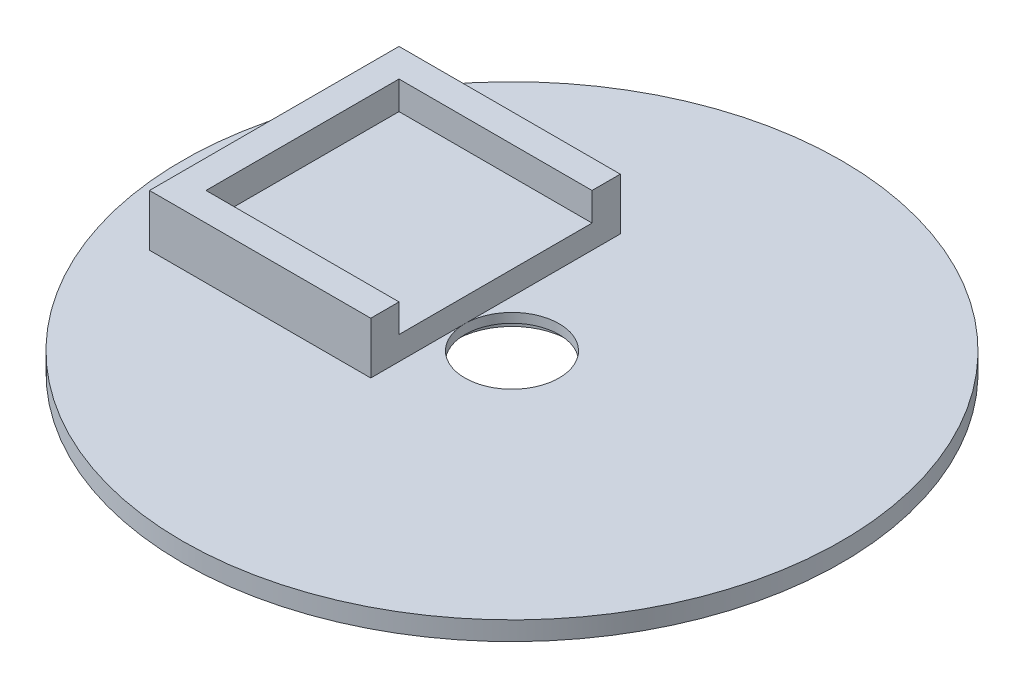
ISO-10303-21;
HEADER;
FILE_DESCRIPTION(('STEP AP214'),'2;1');
FILE_NAME('part.step','',(''),(''),'','','');
FILE_SCHEMA(('AUTOMOTIVE_DESIGN { 1 0 10303 214 1 1 1 1 }'));
ENDSEC;
DATA;
#1=APPLICATION_CONTEXT('core data for automotive mechanical design processes');
#2=APPLICATION_PROTOCOL_DEFINITION('international standard','automotive_design',2000,#1);
#3=PRODUCT_CONTEXT('',#1,'mechanical');
#4=PRODUCT('Part','Part','',(#3));
#5=PRODUCT_RELATED_PRODUCT_CATEGORY('part','',(#4));
#6=PRODUCT_DEFINITION_FORMATION('','',#4);
#7=PRODUCT_DEFINITION_CONTEXT('part definition',#1,'design');
#8=PRODUCT_DEFINITION('design','',#6,#7);
#9=PRODUCT_DEFINITION_SHAPE('','',#8);
#10=(LENGTH_UNIT() NAMED_UNIT(*) SI_UNIT(.MILLI.,.METRE.));
#11=(NAMED_UNIT(*) PLANE_ANGLE_UNIT() SI_UNIT($,.RADIAN.));
#12=(NAMED_UNIT(*) SI_UNIT($,.STERADIAN.) SOLID_ANGLE_UNIT());
#13=UNCERTAINTY_MEASURE_WITH_UNIT(LENGTH_MEASURE(1.E-05),#10,'distance_accuracy_value','');
#14=(GEOMETRIC_REPRESENTATION_CONTEXT(3) GLOBAL_UNCERTAINTY_ASSIGNED_CONTEXT((#13)) GLOBAL_UNIT_ASSIGNED_CONTEXT((#10,
#11,#12)) REPRESENTATION_CONTEXT('',''));
#15=CARTESIAN_POINT('',(0.,0.,0.));
#16=DIRECTION('',(0.,0.,1.));
#17=DIRECTION('',(1.,0.,0.));
#18=AXIS2_PLACEMENT_3D('',#15,#16,#17);
#19=CARTESIAN_POINT('',(0.,2.,0.));
#20=DIRECTION('',(0.,1.,0.));
#21=DIRECTION('',(0.,0.,1.));
#22=AXIS2_PLACEMENT_3D('',#19,#20,#21);
#23=PLANE('',#22);
#24=CARTESIAN_POINT('',(0.,2.,0.));
#25=DIRECTION('',(0.,1.,0.));
#26=DIRECTION('',(0.,0.,1.));
#27=AXIS2_PLACEMENT_3D('',#24,#25,#26);
#28=CIRCLE('',#27,35.);
#29=CARTESIAN_POINT('',(0.,2.,35.));
#30=VERTEX_POINT('',#29);
#31=EDGE_CURVE('E42',#30,#30,#28,.T.);
#32=ORIENTED_EDGE('',*,*,#31,.T.);
#33=EDGE_LOOP('',(#32));
#34=FACE_BOUND('',#33,.T.);
#35=DIRECTION('',(0.,0.,1.));
#36=VECTOR('',#35,1.);
#37=CARTESIAN_POINT('',(-5.,2.,0.));
#38=LINE('',#37,#36);
#39=CARTESIAN_POINT('',(-5.,2.,-16.5));
#40=VERTEX_POINT('',#39);
#41=CARTESIAN_POINT('',(-5.,2.,0.));
#42=VERTEX_POINT('',#41);
#43=EDGE_CURVE('E170',#40,#42,#38,.T.);
#44=ORIENTED_EDGE('',*,*,#43,.T.);
#45=CARTESIAN_POINT('',(0.,2.,0.));
#46=DIRECTION('',(0.,1.,0.));
#47=DIRECTION('',(0.,0.,1.));
#48=AXIS2_PLACEMENT_3D('',#45,#46,#47);
#49=CIRCLE('',#48,5.);
#50=EDGE_CURVE('E128',#42,#42,#49,.T.);
#51=ORIENTED_EDGE('',*,*,#50,.F.);
#52=DIRECTION('',(0.,0.,1.));
#53=VECTOR('',#52,1.);
#54=CARTESIAN_POINT('',(-5.,2.,0.));
#55=LINE('',#54,#53);
#56=CARTESIAN_POINT('',(-5.,2.,10.));
#57=VERTEX_POINT('',#56);
#58=EDGE_CURVE('E158',#42,#57,#55,.T.);
#59=ORIENTED_EDGE('',*,*,#58,.T.);
#60=DIRECTION('',(-1.,0.,0.));
#61=VECTOR('',#60,1.);
#62=CARTESIAN_POINT('',(0.,2.,10.));
#63=LINE('',#62,#61);
#64=CARTESIAN_POINT('',(-28.5,2.,10.));
#65=VERTEX_POINT('',#64);
#66=EDGE_CURVE('E161',#57,#65,#63,.T.);
#67=ORIENTED_EDGE('',*,*,#66,.T.);
#68=DIRECTION('',(0.,0.,-1.));
#69=VECTOR('',#68,1.);
#70=CARTESIAN_POINT('',(-28.5,2.,0.));
#71=LINE('',#70,#69);
#72=CARTESIAN_POINT('',(-28.5,2.,-16.5));
#73=VERTEX_POINT('',#72);
#74=EDGE_CURVE('E164',#65,#73,#71,.T.);
#75=ORIENTED_EDGE('',*,*,#74,.T.);
#76=DIRECTION('',(1.,0.,0.));
#77=VECTOR('',#76,1.);
#78=CARTESIAN_POINT('',(0.,2.,-16.5));
#79=LINE('',#78,#77);
#80=EDGE_CURVE('E167',#73,#40,#79,.T.);
#81=ORIENTED_EDGE('',*,*,#80,.T.);
#82=EDGE_LOOP('',(#44,#51,#59,#67,#75,#81));
#83=FACE_BOUND('',#82,.T.);
#84=ADVANCED_FACE('F34',(#34,#83),#23,.T.);
#85=CARTESIAN_POINT('',(-25.5,7.5,-13.5));
#86=DIRECTION('',(-1.,0.,0.));
#87=DIRECTION('',(0.,0.,1.));
#88=AXIS2_PLACEMENT_3D('',#85,#86,#87);
#89=PLANE('',#88);
#90=DIRECTION('',(0.,0.,1.));
#91=VECTOR('',#90,1.);
#92=CARTESIAN_POINT('',(-25.5,4.5,-13.5));
#93=LINE('',#92,#91);
#94=CARTESIAN_POINT('',(-25.5,4.5,-13.5));
#95=VERTEX_POINT('',#94);
#96=CARTESIAN_POINT('',(-25.5,4.5,7.));
#97=VERTEX_POINT('',#96);
#98=EDGE_CURVE('E49',#95,#97,#93,.T.);
#99=ORIENTED_EDGE('',*,*,#98,.F.);
#100=DIRECTION('',(0.,-1.,0.));
#101=VECTOR('',#100,1.);
#102=CARTESIAN_POINT('',(-25.5,7.5,-13.5));
#103=LINE('',#102,#101);
#104=CARTESIAN_POINT('',(-25.5,7.5,-13.5));
#105=VERTEX_POINT('',#104);
#106=EDGE_CURVE('E156',#105,#95,#103,.T.);
#107=ORIENTED_EDGE('',*,*,#106,.F.);
#108=DIRECTION('',(0.,0.,-1.));
#109=VECTOR('',#108,1.);
#110=CARTESIAN_POINT('',(-25.5,7.5,-13.5));
#111=LINE('',#110,#109);
#112=CARTESIAN_POINT('',(-25.5,7.5,7.));
#113=VERTEX_POINT('',#112);
#114=EDGE_CURVE('E131',#113,#105,#111,.T.);
#115=ORIENTED_EDGE('',*,*,#114,.F.);
#116=DIRECTION('',(0.,-1.,0.));
#117=VECTOR('',#116,1.);
#118=CARTESIAN_POINT('',(-25.5,7.5,7.));
#119=LINE('',#118,#117);
#120=EDGE_CURVE('E113',#113,#97,#119,.T.);
#121=ORIENTED_EDGE('',*,*,#120,.T.);
#122=EDGE_LOOP('',(#99,#107,#115,#121));
#123=FACE_BOUND('',#122,.T.);
#124=ADVANCED_FACE('F202',(#123),#89,.F.);
#125=CARTESIAN_POINT('',(-5.,7.5,-13.5));
#126=DIRECTION('',(0.,0.,-1.));
#127=DIRECTION('',(-1.,0.,0.));
#128=AXIS2_PLACEMENT_3D('',#125,#126,#127);
#129=PLANE('',#128);
#130=DIRECTION('',(-1.,0.,0.));
#131=VECTOR('',#130,1.);
#132=CARTESIAN_POINT('',(-5.,4.5,-13.5));
#133=LINE('',#132,#131);
#134=CARTESIAN_POINT('',(-5.,4.5,-13.5));
#135=VERTEX_POINT('',#134);
#136=EDGE_CURVE('E56',#135,#95,#133,.T.);
#137=ORIENTED_EDGE('',*,*,#136,.F.);
#138=DIRECTION('',(0.,-1.,0.));
#139=VECTOR('',#138,1.);
#140=CARTESIAN_POINT('',(-5.,7.5,-13.5));
#141=LINE('',#140,#139);
#142=CARTESIAN_POINT('',(-5.,7.5,-13.5));
#143=VERTEX_POINT('',#142);
#144=EDGE_CURVE('E122',#143,#135,#141,.T.);
#145=ORIENTED_EDGE('',*,*,#144,.F.);
#146=DIRECTION('',(1.,0.,0.));
#147=VECTOR('',#146,1.);
#148=CARTESIAN_POINT('',(-5.,7.5,-13.5));
#149=LINE('',#148,#147);
#150=EDGE_CURVE('E134',#105,#143,#149,.T.);
#151=ORIENTED_EDGE('',*,*,#150,.F.);
#152=ORIENTED_EDGE('',*,*,#106,.T.);
#153=EDGE_LOOP('',(#137,#145,#151,#152));
#154=FACE_BOUND('',#153,.T.);
#155=ADVANCED_FACE('F208',(#154),#129,.F.);
#156=CARTESIAN_POINT('',(-5.,7.5,7.));
#157=DIRECTION('',(0.,0.,1.));
#158=DIRECTION('',(1.,0.,0.));
#159=AXIS2_PLACEMENT_3D('',#156,#157,#158);
#160=PLANE('',#159);
#161=DIRECTION('',(1.,0.,0.));
#162=VECTOR('',#161,1.);
#163=CARTESIAN_POINT('',(-5.,4.5,7.));
#164=LINE('',#163,#162);
#165=CARTESIAN_POINT('',(-5.,4.5,7.));
#166=VERTEX_POINT('',#165);
#167=EDGE_CURVE('E11',#97,#166,#164,.T.);
#168=ORIENTED_EDGE('',*,*,#167,.F.);
#169=ORIENTED_EDGE('',*,*,#120,.F.);
#170=DIRECTION('',(-1.,0.,0.));
#171=VECTOR('',#170,1.);
#172=CARTESIAN_POINT('',(-5.,7.5,7.));
#173=LINE('',#172,#171);
#174=CARTESIAN_POINT('',(-5.,7.5,7.));
#175=VERTEX_POINT('',#174);
#176=EDGE_CURVE('E108',#175,#113,#173,.T.);
#177=ORIENTED_EDGE('',*,*,#176,.F.);
#178=DIRECTION('',(0.,-1.,0.));
#179=VECTOR('',#178,1.);
#180=CARTESIAN_POINT('',(-5.,7.5,7.));
#181=LINE('',#180,#179);
#182=EDGE_CURVE('E105',#175,#166,#181,.T.);
#183=ORIENTED_EDGE('',*,*,#182,.T.);
#184=EDGE_LOOP('',(#168,#169,#177,#183));
#185=FACE_BOUND('',#184,.T.);
#186=ADVANCED_FACE('F106',(#185),#160,.F.);
#187=CARTESIAN_POINT('',(0.,2.,0.));
#188=DIRECTION('',(0.,-1.,0.));
#189=DIRECTION('',(0.,0.,-1.));
#190=AXIS2_PLACEMENT_3D('',#187,#188,#189);
#191=CYLINDRICAL_SURFACE('',#190,35.);
#192=ORIENTED_EDGE('',*,*,#31,.F.);
#193=EDGE_LOOP('',(#192));
#194=FACE_BOUND('',#193,.T.);
#195=CARTESIAN_POINT('',(0.,0.,0.));
#196=DIRECTION('',(0.,1.,0.));
#197=DIRECTION('',(0.,0.,1.));
#198=AXIS2_PLACEMENT_3D('',#195,#196,#197);
#199=CIRCLE('',#198,35.);
#200=CARTESIAN_POINT('',(0.,0.,35.));
#201=VERTEX_POINT('',#200);
#202=EDGE_CURVE('E176',#201,#201,#199,.T.);
#203=ORIENTED_EDGE('',*,*,#202,.T.);
#204=EDGE_LOOP('',(#203));
#205=FACE_BOUND('',#204,.T.);
#206=ADVANCED_FACE('F36',(#194,#205),#191,.T.);
#207=CARTESIAN_POINT('',(0.,0.,0.));
#208=DIRECTION('',(0.,1.,0.));
#209=DIRECTION('',(0.,0.,1.));
#210=AXIS2_PLACEMENT_3D('',#207,#208,#209);
#211=PLANE('',#210);
#212=ORIENTED_EDGE('',*,*,#202,.F.);
#213=EDGE_LOOP('',(#212));
#214=FACE_BOUND('',#213,.T.);
#215=CARTESIAN_POINT('',(0.,0.,0.));
#216=DIRECTION('',(0.,1.,0.));
#217=DIRECTION('',(0.,0.,1.));
#218=AXIS2_PLACEMENT_3D('',#215,#216,#217);
#219=CIRCLE('',#218,6.);
#220=CARTESIAN_POINT('',(0.,0.,6.));
#221=VERTEX_POINT('',#220);
#222=EDGE_CURVE('E172',#221,#221,#219,.T.);
#223=ORIENTED_EDGE('',*,*,#222,.T.);
#224=EDGE_LOOP('',(#223));
#225=FACE_BOUND('',#224,.T.);
#226=ADVANCED_FACE('F214',(#214,#225),#211,.F.);
#227=CARTESIAN_POINT('',(0.,1.,0.));
#228=DIRECTION('',(0.,-1.,0.));
#229=DIRECTION('',(0.,0.,-1.));
#230=AXIS2_PLACEMENT_3D('',#227,#228,#229);
#231=CYLINDRICAL_SURFACE('',#230,6.);
#232=CARTESIAN_POINT('',(0.,1.,0.));
#233=DIRECTION('',(0.,1.,0.));
#234=DIRECTION('',(0.,0.,1.));
#235=AXIS2_PLACEMENT_3D('',#232,#233,#234);
#236=CIRCLE('',#235,6.);
#237=CARTESIAN_POINT('',(0.,1.,6.));
#238=VERTEX_POINT('',#237);
#239=EDGE_CURVE('E173',#238,#238,#236,.T.);
#240=ORIENTED_EDGE('',*,*,#239,.T.);
#241=EDGE_LOOP('',(#240));
#242=FACE_BOUND('',#241,.T.);
#243=ORIENTED_EDGE('',*,*,#222,.F.);
#244=EDGE_LOOP('',(#243));
#245=FACE_BOUND('',#244,.T.);
#246=ADVANCED_FACE('F212',(#242,#245),#231,.F.);
#247=CARTESIAN_POINT('',(0.,1.,0.));
#248=DIRECTION('',(0.,1.,0.));
#249=DIRECTION('',(0.,0.,1.));
#250=AXIS2_PLACEMENT_3D('',#247,#248,#249);
#251=PLANE('',#250);
#252=CARTESIAN_POINT('',(0.,1.,0.));
#253=DIRECTION('',(0.,1.,0.));
#254=DIRECTION('',(0.,0.,1.));
#255=AXIS2_PLACEMENT_3D('',#252,#253,#254);
#256=CIRCLE('',#255,5.);
#257=CARTESIAN_POINT('',(0.,1.,5.));
#258=VERTEX_POINT('',#257);
#259=EDGE_CURVE('E127',#258,#258,#256,.T.);
#260=ORIENTED_EDGE('',*,*,#259,.T.);
#261=EDGE_LOOP('',(#260));
#262=FACE_BOUND('',#261,.T.);
#263=ORIENTED_EDGE('',*,*,#239,.F.);
#264=EDGE_LOOP('',(#263));
#265=FACE_BOUND('',#264,.T.);
#266=ADVANCED_FACE('F185',(#262,#265),#251,.F.);
#267=CARTESIAN_POINT('',(-5.,7.5,-13.5));
#268=DIRECTION('',(-1.,0.,0.));
#269=DIRECTION('',(0.,0.,1.));
#270=AXIS2_PLACEMENT_3D('',#267,#268,#269);
#271=PLANE('',#270);
#272=ORIENTED_EDGE('',*,*,#43,.F.);
#273=DIRECTION('',(0.,-1.,0.));
#274=VECTOR('',#273,1.);
#275=CARTESIAN_POINT('',(-5.,7.5,-16.5));
#276=LINE('',#275,#274);
#277=CARTESIAN_POINT('',(-5.,7.5,-16.5));
#278=VERTEX_POINT('',#277);
#279=EDGE_CURVE('E153',#278,#40,#276,.T.);
#280=ORIENTED_EDGE('',*,*,#279,.F.);
#281=DIRECTION('',(0.,0.,-1.));
#282=VECTOR('',#281,1.);
#283=CARTESIAN_POINT('',(-5.,7.5,-13.5));
#284=LINE('',#283,#282);
#285=EDGE_CURVE('E136',#143,#278,#284,.T.);
#286=ORIENTED_EDGE('',*,*,#285,.F.);
#287=ORIENTED_EDGE('',*,*,#144,.T.);
#288=DIRECTION('',(0.,0.,-1.));
#289=VECTOR('',#288,1.);
#290=CARTESIAN_POINT('',(-5.,4.5,-16.5));
#291=LINE('',#290,#289);
#292=EDGE_CURVE('E118',#166,#135,#291,.T.);
#293=ORIENTED_EDGE('',*,*,#292,.F.);
#294=ORIENTED_EDGE('',*,*,#182,.F.);
#295=DIRECTION('',(0.,0.,-1.));
#296=VECTOR('',#295,1.);
#297=CARTESIAN_POINT('',(-5.,7.5,7.));
#298=LINE('',#297,#296);
#299=CARTESIAN_POINT('',(-5.,7.5,10.));
#300=VERTEX_POINT('',#299);
#301=EDGE_CURVE('E144',#300,#175,#298,.T.);
#302=ORIENTED_EDGE('',*,*,#301,.F.);
#303=DIRECTION('',(0.,-1.,0.));
#304=VECTOR('',#303,1.);
#305=CARTESIAN_POINT('',(-5.,7.5,10.));
#306=LINE('',#305,#304);
#307=EDGE_CURVE('E112',#300,#57,#306,.T.);
#308=ORIENTED_EDGE('',*,*,#307,.T.);
#309=ORIENTED_EDGE('',*,*,#58,.F.);
#310=EDGE_LOOP('',(#272,#280,#286,#287,#293,#294,#302,#308,#309));
#311=FACE_BOUND('',#310,.T.);
#312=ADVANCED_FACE('F120',(#311),#271,.F.);
#313=CARTESIAN_POINT('',(-5.,7.5,-16.5));
#314=DIRECTION('',(0.,0.,1.));
#315=DIRECTION('',(1.,0.,0.));
#316=AXIS2_PLACEMENT_3D('',#313,#314,#315);
#317=PLANE('',#316);
#318=ORIENTED_EDGE('',*,*,#80,.F.);
#319=DIRECTION('',(0.,-1.,0.));
#320=VECTOR('',#319,1.);
#321=CARTESIAN_POINT('',(-28.5,7.5,-16.5));
#322=LINE('',#321,#320);
#323=CARTESIAN_POINT('',(-28.5,7.5,-16.5));
#324=VERTEX_POINT('',#323);
#325=EDGE_CURVE('E151',#324,#73,#322,.T.);
#326=ORIENTED_EDGE('',*,*,#325,.F.);
#327=DIRECTION('',(-1.,0.,0.));
#328=VECTOR('',#327,1.);
#329=CARTESIAN_POINT('',(-5.,7.5,-16.5));
#330=LINE('',#329,#328);
#331=EDGE_CURVE('E138',#278,#324,#330,.T.);
#332=ORIENTED_EDGE('',*,*,#331,.F.);
#333=ORIENTED_EDGE('',*,*,#279,.T.);
#334=EDGE_LOOP('',(#318,#326,#332,#333));
#335=FACE_BOUND('',#334,.T.);
#336=ADVANCED_FACE('F244',(#335),#317,.F.);
#337=CARTESIAN_POINT('',(-28.5,7.5,-16.5));
#338=DIRECTION('',(1.,0.,0.));
#339=DIRECTION('',(0.,0.,-1.));
#340=AXIS2_PLACEMENT_3D('',#337,#338,#339);
#341=PLANE('',#340);
#342=ORIENTED_EDGE('',*,*,#74,.F.);
#343=DIRECTION('',(0.,-1.,0.));
#344=VECTOR('',#343,1.);
#345=CARTESIAN_POINT('',(-28.5,7.5,10.));
#346=LINE('',#345,#344);
#347=CARTESIAN_POINT('',(-28.5,7.5,10.));
#348=VERTEX_POINT('',#347);
#349=EDGE_CURVE('E149',#348,#65,#346,.T.);
#350=ORIENTED_EDGE('',*,*,#349,.F.);
#351=DIRECTION('',(0.,0.,1.));
#352=VECTOR('',#351,1.);
#353=CARTESIAN_POINT('',(-28.5,7.5,-16.5));
#354=LINE('',#353,#352);
#355=EDGE_CURVE('E140',#324,#348,#354,.T.);
#356=ORIENTED_EDGE('',*,*,#355,.F.);
#357=ORIENTED_EDGE('',*,*,#325,.T.);
#358=EDGE_LOOP('',(#342,#350,#356,#357));
#359=FACE_BOUND('',#358,.T.);
#360=ADVANCED_FACE('F240',(#359),#341,.F.);
#361=CARTESIAN_POINT('',(-5.,7.5,10.));
#362=DIRECTION('',(0.,0.,-1.));
#363=DIRECTION('',(-1.,0.,0.));
#364=AXIS2_PLACEMENT_3D('',#361,#362,#363);
#365=PLANE('',#364);
#366=ORIENTED_EDGE('',*,*,#66,.F.);
#367=ORIENTED_EDGE('',*,*,#307,.F.);
#368=DIRECTION('',(1.,0.,0.));
#369=VECTOR('',#368,1.);
#370=CARTESIAN_POINT('',(-5.,7.5,10.));
#371=LINE('',#370,#369);
#372=EDGE_CURVE('E142',#348,#300,#371,.T.);
#373=ORIENTED_EDGE('',*,*,#372,.F.);
#374=ORIENTED_EDGE('',*,*,#349,.T.);
#375=EDGE_LOOP('',(#366,#367,#373,#374));
#376=FACE_BOUND('',#375,.T.);
#377=ADVANCED_FACE('F198',(#376),#365,.F.);
#378=CARTESIAN_POINT('',(0.,7.5,0.));
#379=DIRECTION('',(0.,-1.,0.));
#380=DIRECTION('',(0.,0.,-1.));
#381=AXIS2_PLACEMENT_3D('',#378,#379,#380);
#382=PLANE('',#381);
#383=ORIENTED_EDGE('',*,*,#114,.T.);
#384=ORIENTED_EDGE('',*,*,#150,.T.);
#385=ORIENTED_EDGE('',*,*,#285,.T.);
#386=ORIENTED_EDGE('',*,*,#331,.T.);
#387=ORIENTED_EDGE('',*,*,#355,.T.);
#388=ORIENTED_EDGE('',*,*,#372,.T.);
#389=ORIENTED_EDGE('',*,*,#301,.T.);
#390=ORIENTED_EDGE('',*,*,#176,.T.);
#391=EDGE_LOOP('',(#383,#384,#385,#386,#387,#388,#389,#390));
#392=FACE_BOUND('',#391,.T.);
#393=ADVANCED_FACE('F190',(#392),#382,.F.);
#394=CARTESIAN_POINT('',(0.,7.5,0.));
#395=DIRECTION('',(0.,-1.,0.));
#396=DIRECTION('',(0.,0.,-1.));
#397=AXIS2_PLACEMENT_3D('',#394,#395,#396);
#398=CYLINDRICAL_SURFACE('',#397,5.);
#399=ORIENTED_EDGE('',*,*,#50,.T.);
#400=EDGE_LOOP('',(#399));
#401=FACE_BOUND('',#400,.T.);
#402=ORIENTED_EDGE('',*,*,#259,.F.);
#403=EDGE_LOOP('',(#402));
#404=FACE_BOUND('',#403,.T.);
#405=ADVANCED_FACE('F188',(#401,#404),#398,.F.);
#406=CARTESIAN_POINT('',(0.,4.5,0.));
#407=DIRECTION('',(0.,-1.,0.));
#408=DIRECTION('',(0.,0.,-1.));
#409=AXIS2_PLACEMENT_3D('',#406,#407,#408);
#410=PLANE('',#409);
#411=ORIENTED_EDGE('',*,*,#292,.T.);
#412=ORIENTED_EDGE('',*,*,#136,.T.);
#413=ORIENTED_EDGE('',*,*,#98,.T.);
#414=ORIENTED_EDGE('',*,*,#167,.T.);
#415=EDGE_LOOP('',(#411,#412,#413,#414));
#416=FACE_BOUND('',#415,.T.);
#417=ADVANCED_FACE('F117',(#416),#410,.F.);
#418=CLOSED_SHELL('',(#84,#124,#155,#186,#206,#226,#246,#266,#312,#336,#360,#377,#393,#405,#417));
#419=MANIFOLD_SOLID_BREP('B2',#418);
#420=ADVANCED_BREP_SHAPE_REPRESENTATION('',(#18,#419),#14);
#421=SHAPE_DEFINITION_REPRESENTATION(#9,#420);
ENDSEC;
END-ISO-10303-21;
